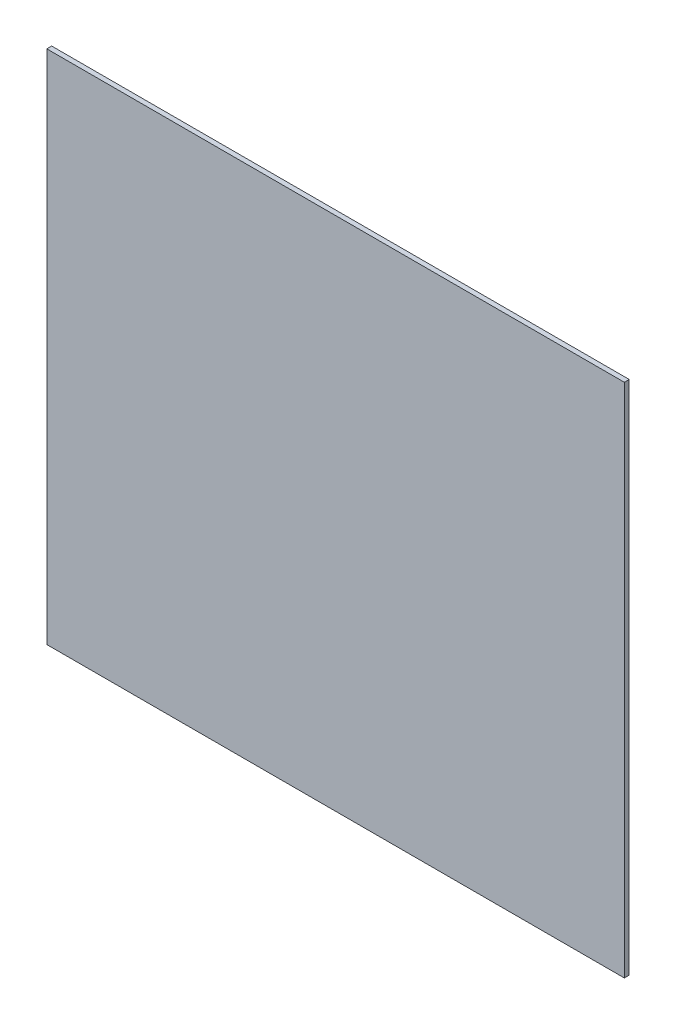
ISO-10303-21;
HEADER;
FILE_DESCRIPTION(('STEP AP214'),'2;1');
FILE_NAME('part.step','',(''),(''),'','','');
FILE_SCHEMA(('AUTOMOTIVE_DESIGN { 1 0 10303 214 1 1 1 1 }'));
ENDSEC;
DATA;
#1=APPLICATION_CONTEXT('core data for automotive mechanical design processes');
#2=APPLICATION_PROTOCOL_DEFINITION('international standard','automotive_design',2000,#1);
#3=PRODUCT_CONTEXT('',#1,'mechanical');
#4=PRODUCT('Part','Part','',(#3));
#5=PRODUCT_RELATED_PRODUCT_CATEGORY('part','',(#4));
#6=PRODUCT_DEFINITION_FORMATION('','',#4);
#7=PRODUCT_DEFINITION_CONTEXT('part definition',#1,'design');
#8=PRODUCT_DEFINITION('design','',#6,#7);
#9=PRODUCT_DEFINITION_SHAPE('','',#8);
#10=(LENGTH_UNIT() NAMED_UNIT(*) SI_UNIT(.MILLI.,.METRE.));
#11=(NAMED_UNIT(*) PLANE_ANGLE_UNIT() SI_UNIT($,.RADIAN.));
#12=(NAMED_UNIT(*) SI_UNIT($,.STERADIAN.) SOLID_ANGLE_UNIT());
#13=UNCERTAINTY_MEASURE_WITH_UNIT(LENGTH_MEASURE(1.E-05),#10,'distance_accuracy_value','');
#14=(GEOMETRIC_REPRESENTATION_CONTEXT(3) GLOBAL_UNCERTAINTY_ASSIGNED_CONTEXT((#13)) GLOBAL_UNIT_ASSIGNED_CONTEXT((#10,
#11,#12)) REPRESENTATION_CONTEXT('',''));
#15=CARTESIAN_POINT('',(0.,0.,0.));
#16=DIRECTION('',(0.,0.,1.));
#17=DIRECTION('',(1.,0.,0.));
#18=AXIS2_PLACEMENT_3D('',#15,#16,#17);
#19=CARTESIAN_POINT('',(-168.246575342466,86.5616438356165,3.));
#20=DIRECTION('',(1.,0.,0.));
#21=DIRECTION('',(0.,1.,0.));
#22=AXIS2_PLACEMENT_3D('',#19,#20,#21);
#23=PLANE('',#22);
#24=DIRECTION('',(0.,-1.,0.));
#25=VECTOR('',#24,1.);
#26=CARTESIAN_POINT('',(-168.246575342466,86.5616438356165,0.));
#27=LINE('',#26,#25);
#28=CARTESIAN_POINT('',(-168.246575342466,86.5616438356165,0.));
#29=VERTEX_POINT('',#28);
#30=CARTESIAN_POINT('',(-168.246575342466,-231.438356164384,0.));
#31=VERTEX_POINT('',#30);
#32=EDGE_CURVE('E100',#29,#31,#27,.T.);
#33=ORIENTED_EDGE('',*,*,#32,.T.);
#34=DIRECTION('',(0.,0.,-1.));
#35=VECTOR('',#34,1.);
#36=CARTESIAN_POINT('',(-168.246575342466,-231.438356164384,3.));
#37=LINE('',#36,#35);
#38=CARTESIAN_POINT('',(-168.246575342466,-231.438356164384,3.));
#39=VERTEX_POINT('',#38);
#40=EDGE_CURVE('E11',#39,#31,#37,.T.);
#41=ORIENTED_EDGE('',*,*,#40,.F.);
#42=DIRECTION('',(0.,-1.,0.));
#43=VECTOR('',#42,1.);
#44=CARTESIAN_POINT('',(-168.246575342466,86.5616438356165,3.));
#45=LINE('',#44,#43);
#46=CARTESIAN_POINT('',(-168.246575342466,86.5616438356165,3.));
#47=VERTEX_POINT('',#46);
#48=EDGE_CURVE('E88',#47,#39,#45,.T.);
#49=ORIENTED_EDGE('',*,*,#48,.F.);
#50=DIRECTION('',(0.,0.,-1.));
#51=VECTOR('',#50,1.);
#52=CARTESIAN_POINT('',(-168.246575342466,86.5616438356165,3.));
#53=LINE('',#52,#51);
#54=EDGE_CURVE('E96',#47,#29,#53,.T.);
#55=ORIENTED_EDGE('',*,*,#54,.T.);
#56=EDGE_LOOP('',(#33,#41,#49,#55));
#57=FACE_BOUND('',#56,.T.);
#58=ADVANCED_FACE('F37',(#57),#23,.F.);
#59=CARTESIAN_POINT('',(-168.246575342466,-231.438356164384,3.));
#60=DIRECTION('',(0.,1.,0.));
#61=DIRECTION('',(0.,0.,1.));
#62=AXIS2_PLACEMENT_3D('',#59,#60,#61);
#63=PLANE('',#62);
#64=DIRECTION('',(1.,0.,0.));
#65=VECTOR('',#64,1.);
#66=CARTESIAN_POINT('',(-168.246575342466,-231.438356164384,0.));
#67=LINE('',#66,#65);
#68=CARTESIAN_POINT('',(187.753424657534,-231.438356164384,0.));
#69=VERTEX_POINT('',#68);
#70=EDGE_CURVE('E92',#31,#69,#67,.T.);
#71=ORIENTED_EDGE('',*,*,#70,.T.);
#72=DIRECTION('',(0.,0.,-1.));
#73=VECTOR('',#72,1.);
#74=CARTESIAN_POINT('',(187.753424657534,-231.438356164384,3.));
#75=LINE('',#74,#73);
#76=CARTESIAN_POINT('',(187.753424657534,-231.438356164384,3.));
#77=VERTEX_POINT('',#76);
#78=EDGE_CURVE('E45',#77,#69,#75,.T.);
#79=ORIENTED_EDGE('',*,*,#78,.F.);
#80=DIRECTION('',(1.,0.,0.));
#81=VECTOR('',#80,1.);
#82=CARTESIAN_POINT('',(-168.246575342466,-231.438356164384,3.));
#83=LINE('',#82,#81);
#84=EDGE_CURVE('E83',#39,#77,#83,.T.);
#85=ORIENTED_EDGE('',*,*,#84,.F.);
#86=ORIENTED_EDGE('',*,*,#40,.T.);
#87=EDGE_LOOP('',(#71,#79,#85,#86));
#88=FACE_BOUND('',#87,.T.);
#89=ADVANCED_FACE('F91',(#88),#63,.F.);
#90=CARTESIAN_POINT('',(187.753424657534,86.5616438356165,3.));
#91=DIRECTION('',(-1.,0.,0.));
#92=DIRECTION('',(0.,-1.,0.));
#93=AXIS2_PLACEMENT_3D('',#90,#91,#92);
#94=PLANE('',#93);
#95=DIRECTION('',(0.,1.,0.));
#96=VECTOR('',#95,1.);
#97=CARTESIAN_POINT('',(187.753424657534,86.5616438356165,0.));
#98=LINE('',#97,#96);
#99=CARTESIAN_POINT('',(187.753424657534,86.5616438356165,0.));
#100=VERTEX_POINT('',#99);
#101=EDGE_CURVE('E70',#69,#100,#98,.T.);
#102=ORIENTED_EDGE('',*,*,#101,.T.);
#103=DIRECTION('',(0.,0.,-1.));
#104=VECTOR('',#103,1.);
#105=CARTESIAN_POINT('',(187.753424657534,86.5616438356165,3.));
#106=LINE('',#105,#104);
#107=CARTESIAN_POINT('',(187.753424657534,86.5616438356165,3.));
#108=VERTEX_POINT('',#107);
#109=EDGE_CURVE('E93',#108,#100,#106,.T.);
#110=ORIENTED_EDGE('',*,*,#109,.F.);
#111=DIRECTION('',(0.,1.,0.));
#112=VECTOR('',#111,1.);
#113=CARTESIAN_POINT('',(187.753424657534,86.5616438356165,3.));
#114=LINE('',#113,#112);
#115=EDGE_CURVE('E86',#77,#108,#114,.T.);
#116=ORIENTED_EDGE('',*,*,#115,.F.);
#117=ORIENTED_EDGE('',*,*,#78,.T.);
#118=EDGE_LOOP('',(#102,#110,#116,#117));
#119=FACE_BOUND('',#118,.T.);
#120=ADVANCED_FACE('F94',(#119),#94,.F.);
#121=CARTESIAN_POINT('',(-168.246575342466,86.5616438356165,3.));
#122=DIRECTION('',(0.,-1.,0.));
#123=DIRECTION('',(0.,0.,-1.));
#124=AXIS2_PLACEMENT_3D('',#121,#122,#123);
#125=PLANE('',#124);
#126=DIRECTION('',(-1.,0.,0.));
#127=VECTOR('',#126,1.);
#128=CARTESIAN_POINT('',(-168.246575342466,86.5616438356165,0.));
#129=LINE('',#128,#127);
#130=EDGE_CURVE('E76',#100,#29,#129,.T.);
#131=ORIENTED_EDGE('',*,*,#130,.T.);
#132=ORIENTED_EDGE('',*,*,#54,.F.);
#133=DIRECTION('',(-1.,0.,0.));
#134=VECTOR('',#133,1.);
#135=CARTESIAN_POINT('',(-168.246575342466,86.5616438356165,3.));
#136=LINE('',#135,#134);
#137=EDGE_CURVE('E53',#108,#47,#136,.T.);
#138=ORIENTED_EDGE('',*,*,#137,.F.);
#139=ORIENTED_EDGE('',*,*,#109,.T.);
#140=EDGE_LOOP('',(#131,#132,#138,#139));
#141=FACE_BOUND('',#140,.T.);
#142=ADVANCED_FACE('F107',(#141),#125,.F.);
#143=CARTESIAN_POINT('',(0.,0.,3.));
#144=DIRECTION('',(0.,0.,1.));
#145=DIRECTION('',(1.,0.,0.));
#146=AXIS2_PLACEMENT_3D('',#143,#144,#145);
#147=PLANE('',#146);
#148=ORIENTED_EDGE('',*,*,#48,.T.);
#149=ORIENTED_EDGE('',*,*,#84,.T.);
#150=ORIENTED_EDGE('',*,*,#115,.T.);
#151=ORIENTED_EDGE('',*,*,#137,.T.);
#152=EDGE_LOOP('',(#148,#149,#150,#151));
#153=FACE_BOUND('',#152,.T.);
#154=ADVANCED_FACE('F84',(#153),#147,.T.);
#155=CARTESIAN_POINT('',(0.,0.,0.));
#156=DIRECTION('',(0.,0.,1.));
#157=DIRECTION('',(1.,0.,0.));
#158=AXIS2_PLACEMENT_3D('',#155,#156,#157);
#159=PLANE('',#158);
#160=ORIENTED_EDGE('',*,*,#32,.F.);
#161=ORIENTED_EDGE('',*,*,#130,.F.);
#162=ORIENTED_EDGE('',*,*,#101,.F.);
#163=ORIENTED_EDGE('',*,*,#70,.F.);
#164=EDGE_LOOP('',(#160,#161,#162,#163));
#165=FACE_BOUND('',#164,.T.);
#166=ADVANCED_FACE('F110',(#165),#159,.F.);
#167=CLOSED_SHELL('',(#58,#89,#120,#142,#154,#166));
#168=MANIFOLD_SOLID_BREP('B2',#167);
#169=ADVANCED_BREP_SHAPE_REPRESENTATION('',(#18,#168),#14);
#170=SHAPE_DEFINITION_REPRESENTATION(#9,#169);
ENDSEC;
END-ISO-10303-21;
